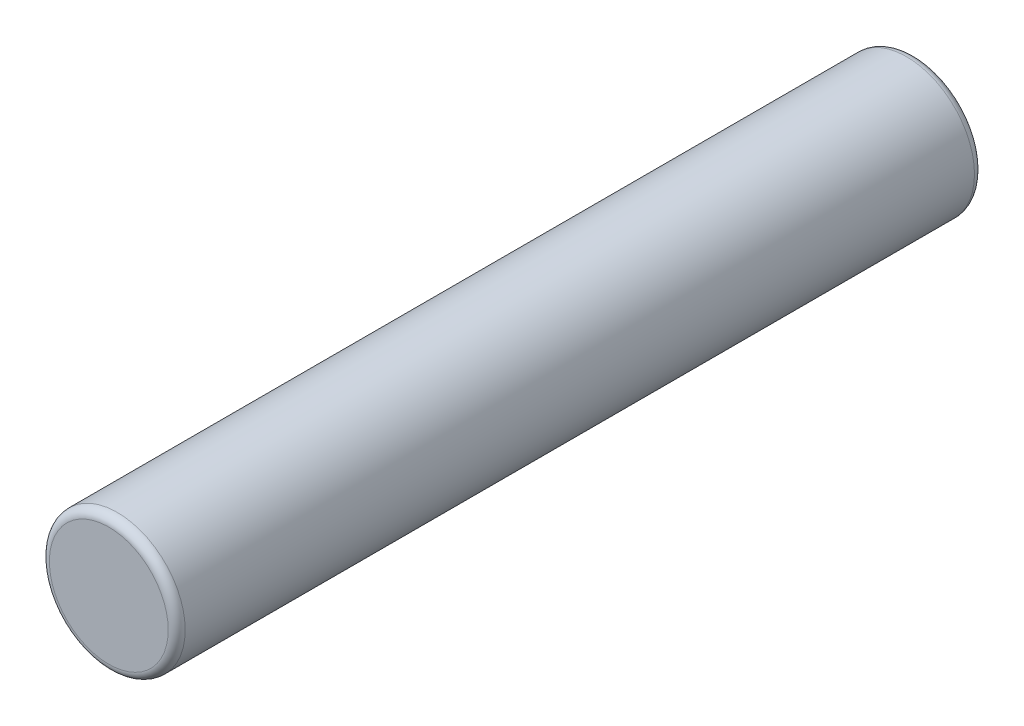
ISO-10303-21;
HEADER;
FILE_DESCRIPTION(('STEP AP214'),'2;1');
FILE_NAME('part.step','',(''),(''),'','','');
FILE_SCHEMA(('AUTOMOTIVE_DESIGN { 1 0 10303 214 1 1 1 1 }'));
ENDSEC;
DATA;
#1=APPLICATION_CONTEXT('core data for automotive mechanical design processes');
#2=APPLICATION_PROTOCOL_DEFINITION('international standard','automotive_design',2000,#1);
#3=PRODUCT_CONTEXT('',#1,'mechanical');
#4=PRODUCT('Part','Part','',(#3));
#5=PRODUCT_RELATED_PRODUCT_CATEGORY('part','',(#4));
#6=PRODUCT_DEFINITION_FORMATION('','',#4);
#7=PRODUCT_DEFINITION_CONTEXT('part definition',#1,'design');
#8=PRODUCT_DEFINITION('design','',#6,#7);
#9=PRODUCT_DEFINITION_SHAPE('','',#8);
#10=(LENGTH_UNIT() NAMED_UNIT(*) SI_UNIT(.MILLI.,.METRE.));
#11=(NAMED_UNIT(*) PLANE_ANGLE_UNIT() SI_UNIT($,.RADIAN.));
#12=(NAMED_UNIT(*) SI_UNIT($,.STERADIAN.) SOLID_ANGLE_UNIT());
#13=UNCERTAINTY_MEASURE_WITH_UNIT(LENGTH_MEASURE(1.E-05),#10,'distance_accuracy_value','');
#14=(GEOMETRIC_REPRESENTATION_CONTEXT(3) GLOBAL_UNCERTAINTY_ASSIGNED_CONTEXT((#13)) GLOBAL_UNIT_ASSIGNED_CONTEXT((#10,
#11,#12)) REPRESENTATION_CONTEXT('',''));
#15=CARTESIAN_POINT('',(0.,0.,0.));
#16=DIRECTION('',(0.,0.,1.));
#17=DIRECTION('',(1.,0.,0.));
#18=AXIS2_PLACEMENT_3D('',#15,#16,#17);
#19=CARTESIAN_POINT('',(-1.69118279620198,0.341226967721208,9.5));
#20=DIRECTION('',(0.,0.,-1.));
#21=DIRECTION('',(-1.,0.,0.));
#22=AXIS2_PLACEMENT_3D('',#19,#20,#21);
#23=CYLINDRICAL_SURFACE('',#22,0.8);
#24=CARTESIAN_POINT('',(-1.69118279620198,0.341226967721208,0.0999999999999994));
#25=DIRECTION('',(0.,0.,1.));
#26=DIRECTION('',(1.,0.,0.));
#27=AXIS2_PLACEMENT_3D('',#24,#25,#26);
#28=CIRCLE('',#27,0.8);
#29=CARTESIAN_POINT('',(-0.89118279620198,0.341226967721208,0.0999999999999994));
#30=VERTEX_POINT('',#29);
#31=EDGE_CURVE('E50',#30,#30,#28,.T.);
#32=ORIENTED_EDGE('',*,*,#31,.T.);
#33=EDGE_LOOP('',(#32));
#34=FACE_BOUND('',#33,.T.);
#35=CARTESIAN_POINT('',(-1.69118279620198,0.341226967721208,9.4));
#36=DIRECTION('',(0.,0.,1.));
#37=DIRECTION('',(1.,0.,0.));
#38=AXIS2_PLACEMENT_3D('',#35,#36,#37);
#39=CIRCLE('',#38,0.8);
#40=CARTESIAN_POINT('',(-0.89118279620198,0.341226967721208,9.4));
#41=VERTEX_POINT('',#40);
#42=EDGE_CURVE('E55',#41,#41,#39,.F.);
#43=ORIENTED_EDGE('',*,*,#42,.T.);
#44=EDGE_LOOP('',(#43));
#45=FACE_BOUND('',#44,.T.);
#46=ADVANCED_FACE('F37',(#34,#45),#23,.T.);
#47=CARTESIAN_POINT('',(-1.69118279620198,0.341226967721208,9.5));
#48=DIRECTION('',(0.,0.,1.));
#49=DIRECTION('',(1.,0.,0.));
#50=AXIS2_PLACEMENT_3D('',#47,#48,#49);
#51=PLANE('',#50);
#52=CARTESIAN_POINT('',(-1.69118279620198,0.341226967721208,9.5));
#53=DIRECTION('',(0.,0.,1.));
#54=DIRECTION('',(1.,0.,0.));
#55=AXIS2_PLACEMENT_3D('',#52,#53,#54);
#56=CIRCLE('',#55,0.7);
#57=CARTESIAN_POINT('',(-0.99118279620198,0.341226967721208,9.5));
#58=VERTEX_POINT('',#57);
#59=EDGE_CURVE('E10',#58,#58,#56,.T.);
#60=ORIENTED_EDGE('',*,*,#59,.T.);
#61=EDGE_LOOP('',(#60));
#62=FACE_BOUND('',#61,.T.);
#63=ADVANCED_FACE('F72',(#62),#51,.T.);
#64=CARTESIAN_POINT('',(-1.69118279620198,0.341226967721208,0.));
#65=DIRECTION('',(0.,0.,1.));
#66=DIRECTION('',(1.,0.,0.));
#67=AXIS2_PLACEMENT_3D('',#64,#65,#66);
#68=PLANE('',#67);
#69=CARTESIAN_POINT('',(-1.69118279620198,0.341226967721208,0.));
#70=DIRECTION('',(0.,0.,1.));
#71=DIRECTION('',(1.,0.,0.));
#72=AXIS2_PLACEMENT_3D('',#69,#70,#71);
#73=CIRCLE('',#72,0.7);
#74=CARTESIAN_POINT('',(-0.99118279620198,0.341226967721208,0.));
#75=VERTEX_POINT('',#74);
#76=EDGE_CURVE('E45',#75,#75,#73,.F.);
#77=ORIENTED_EDGE('',*,*,#76,.T.);
#78=EDGE_LOOP('',(#77));
#79=FACE_BOUND('',#78,.T.);
#80=ADVANCED_FACE('F69',(#79),#68,.F.);
#81=CARTESIAN_POINT('',(-1.69118279620198,0.341226967721208,0.0999999999999994));
#82=DIRECTION('',(0.,0.,1.));
#83=DIRECTION('',(1.,0.,0.));
#84=AXIS2_PLACEMENT_3D('',#81,#82,#83);
#85=TOROIDAL_SURFACE('',#84,0.7,0.1);
#86=ORIENTED_EDGE('',*,*,#76,.F.);
#87=EDGE_LOOP('',(#86));
#88=FACE_BOUND('',#87,.T.);
#89=ORIENTED_EDGE('',*,*,#31,.F.);
#90=EDGE_LOOP('',(#89));
#91=FACE_BOUND('',#90,.T.);
#92=ADVANCED_FACE('F65',(#88,#91),#85,.T.);
#93=CARTESIAN_POINT('',(-1.69118279620198,0.341226967721208,9.4));
#94=DIRECTION('',(0.,0.,1.));
#95=DIRECTION('',(1.,0.,0.));
#96=AXIS2_PLACEMENT_3D('',#93,#94,#95);
#97=TOROIDAL_SURFACE('',#96,0.7,0.1);
#98=ORIENTED_EDGE('',*,*,#42,.F.);
#99=EDGE_LOOP('',(#98));
#100=FACE_BOUND('',#99,.T.);
#101=ORIENTED_EDGE('',*,*,#59,.F.);
#102=EDGE_LOOP('',(#101));
#103=FACE_BOUND('',#102,.T.);
#104=ADVANCED_FACE('F39',(#100,#103),#97,.T.);
#105=CLOSED_SHELL('',(#46,#63,#80,#92,#104));
#106=MANIFOLD_SOLID_BREP('B2',#105);
#107=ADVANCED_BREP_SHAPE_REPRESENTATION('',(#18,#106),#14);
#108=SHAPE_DEFINITION_REPRESENTATION(#9,#107);
ENDSEC;
END-ISO-10303-21;
